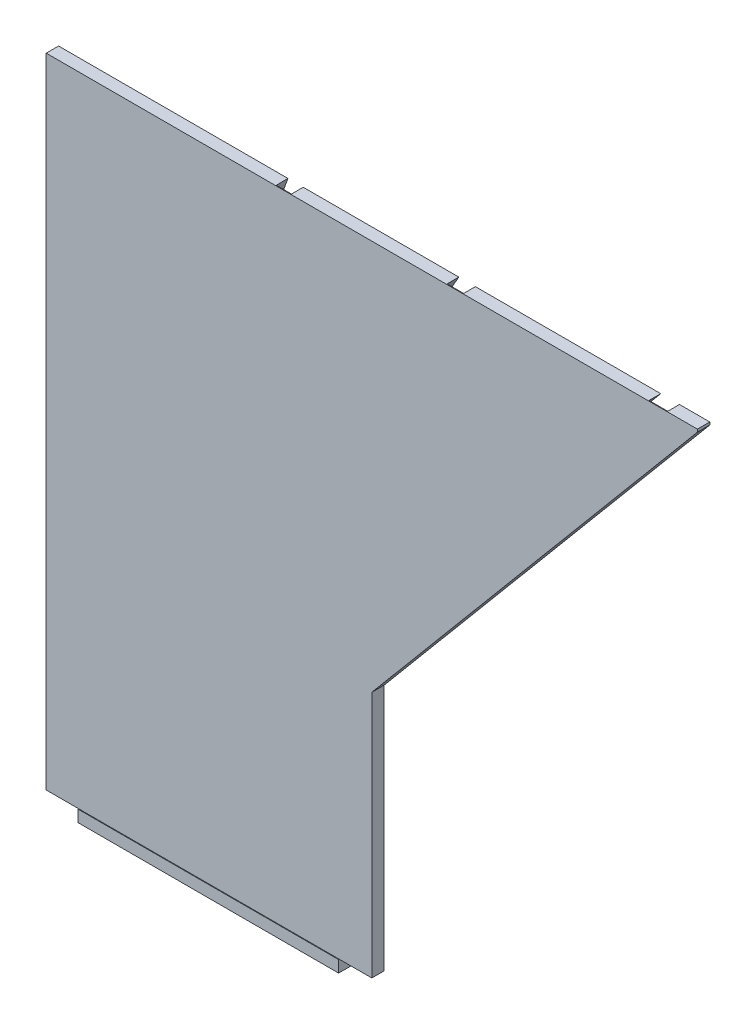
ISO-10303-21;
HEADER;
FILE_DESCRIPTION(('STEP AP214'),'2;1');
FILE_NAME('part.step','',(''),(''),'','','');
FILE_SCHEMA(('AUTOMOTIVE_DESIGN { 1 0 10303 214 1 1 1 1 }'));
ENDSEC;
DATA;
#1=APPLICATION_CONTEXT('core data for automotive mechanical design processes');
#2=APPLICATION_PROTOCOL_DEFINITION('international standard','automotive_design',2000,#1);
#3=PRODUCT_CONTEXT('',#1,'mechanical');
#4=PRODUCT('Part','Part','',(#3));
#5=PRODUCT_RELATED_PRODUCT_CATEGORY('part','',(#4));
#6=PRODUCT_DEFINITION_FORMATION('','',#4);
#7=PRODUCT_DEFINITION_CONTEXT('part definition',#1,'design');
#8=PRODUCT_DEFINITION('design','',#6,#7);
#9=PRODUCT_DEFINITION_SHAPE('','',#8);
#10=(LENGTH_UNIT() NAMED_UNIT(*) SI_UNIT(.MILLI.,.METRE.));
#11=(NAMED_UNIT(*) PLANE_ANGLE_UNIT() SI_UNIT($,.RADIAN.));
#12=(NAMED_UNIT(*) SI_UNIT($,.STERADIAN.) SOLID_ANGLE_UNIT());
#13=UNCERTAINTY_MEASURE_WITH_UNIT(LENGTH_MEASURE(1.E-05),#10,'distance_accuracy_value','');
#14=(GEOMETRIC_REPRESENTATION_CONTEXT(3) GLOBAL_UNCERTAINTY_ASSIGNED_CONTEXT((#13)) GLOBAL_UNIT_ASSIGNED_CONTEXT((#10,
#11,#12)) REPRESENTATION_CONTEXT('',''));
#15=CARTESIAN_POINT('',(0.,0.,0.));
#16=DIRECTION('',(0.,0.,1.));
#17=DIRECTION('',(1.,0.,0.));
#18=AXIS2_PLACEMENT_3D('',#15,#16,#17);
#19=CARTESIAN_POINT('',(1.98987915939745,-1.66970686873775,1.9));
#20=DIRECTION('',(0.76604444311898,-0.642787609686537,0.));
#21=DIRECTION('',(0.642787609686537,0.76604444311898,0.));
#22=AXIS2_PLACEMENT_3D('',#19,#20,#21);
#23=PLANE('',#22);
#24=DIRECTION('',(0.642787609686537,0.766044443118979,0.));
#25=VECTOR('',#24,1.);
#26=CARTESIAN_POINT('',(45.3459111359932,50.,1.8));
#27=LINE('',#26,#25);
#28=CARTESIAN_POINT('',(-19.5261489634952,-27.3115106825532,1.8));
#29=VERTEX_POINT('',#28);
#30=CARTESIAN_POINT('',(45.3459111359932,50.,1.8));
#31=VERTEX_POINT('',#30);
#32=EDGE_CURVE('E59',#29,#31,#27,.T.);
#33=ORIENTED_EDGE('',*,*,#32,.T.);
#34=DIRECTION('',(0.,0.,-1.));
#35=VECTOR('',#34,1.);
#36=CARTESIAN_POINT('',(45.3459111359932,50.,1.9));
#37=LINE('',#36,#35);
#38=CARTESIAN_POINT('',(45.3459111359932,50.,0.));
#39=VERTEX_POINT('',#38);
#40=EDGE_CURVE('E338',#31,#39,#37,.T.);
#41=ORIENTED_EDGE('',*,*,#40,.T.);
#42=DIRECTION('',(-0.642787609686537,-0.76604444311898,0.));
#43=VECTOR('',#42,1.);
#44=CARTESIAN_POINT('',(1.98987915939745,-1.66970686873775,0.));
#45=LINE('',#44,#43);
#46=CARTESIAN_POINT('',(-19.5261489634952,-27.3115106825532,0.));
#47=VERTEX_POINT('',#46);
#48=EDGE_CURVE('E281',#39,#47,#45,.T.);
#49=ORIENTED_EDGE('',*,*,#48,.T.);
#50=DIRECTION('',(0.,0.,-1.));
#51=VECTOR('',#50,1.);
#52=CARTESIAN_POINT('',(-19.5261489634952,-27.3115106825532,1.9));
#53=LINE('',#52,#51);
#54=EDGE_CURVE('E336',#29,#47,#53,.T.);
#55=ORIENTED_EDGE('',*,*,#54,.F.);
#56=EDGE_LOOP('',(#33,#41,#49,#55));
#57=FACE_BOUND('',#56,.T.);
#58=ADVANCED_FACE('F41',(#57),#23,.F.);
#59=CARTESIAN_POINT('',(-21.5160281228926,-25.6418038138154,1.9));
#60=DIRECTION('',(0.642787609686537,0.76604444311898,0.));
#61=DIRECTION('',(-0.76604444311898,0.642787609686537,0.));
#62=AXIS2_PLACEMENT_3D('',#59,#60,#61);
#63=PLANE('',#62);
#64=DIRECTION('',(0.,0.,-1.));
#65=VECTOR('',#64,1.);
#66=CARTESIAN_POINT('',(-21.2114467383573,-25.8973779412424,1.9));
#67=LINE('',#66,#65);
#68=CARTESIAN_POINT('',(-21.2114467383573,-25.8973779412424,1.8));
#69=VERTEX_POINT('',#68);
#70=CARTESIAN_POINT('',(-21.2114467383573,-25.8973779412424,0.));
#71=VERTEX_POINT('',#70);
#72=EDGE_CURVE('E334',#69,#71,#67,.T.);
#73=ORIENTED_EDGE('',*,*,#72,.F.);
#74=DIRECTION('',(0.766044443118977,-0.64278760968654,0.));
#75=VECTOR('',#74,1.);
#76=CARTESIAN_POINT('',(-19.5261489634952,-27.3115106825532,1.8));
#77=LINE('',#76,#75);
#78=EDGE_CURVE('E67',#69,#29,#77,.T.);
#79=ORIENTED_EDGE('',*,*,#78,.T.);
#80=ORIENTED_EDGE('',*,*,#54,.T.);
#81=DIRECTION('',(0.76604444311898,-0.642787609686537,0.));
#82=VECTOR('',#81,1.);
#83=CARTESIAN_POINT('',(-21.5160281228926,-25.6418038138154,0.));
#84=LINE('',#83,#82);
#85=EDGE_CURVE('E286',#71,#47,#84,.T.);
#86=ORIENTED_EDGE('',*,*,#85,.F.);
#87=EDGE_LOOP('',(#73,#79,#80,#86));
#88=FACE_BOUND('',#87,.T.);
#89=ADVANCED_FACE('F439',(#88),#63,.T.);
#90=CARTESIAN_POINT('',(0.304581384535392,-0.255574127427114,1.9));
#91=DIRECTION('',(0.766044443118976,-0.642787609686542,0.));
#92=DIRECTION('',(0.642787609686542,0.766044443118976,0.));
#93=AXIS2_PLACEMENT_3D('',#90,#91,#92);
#94=PLANE('',#93);
#95=DIRECTION('',(0.,0.,-1.));
#96=VECTOR('',#95,1.);
#97=CARTESIAN_POINT('',(42.4740150994622,50.,1.9));
#98=LINE('',#97,#96);
#99=CARTESIAN_POINT('',(42.4740150994622,50.,1.8));
#100=VERTEX_POINT('',#99);
#101=CARTESIAN_POINT('',(42.4740150994622,50.,0.));
#102=VERTEX_POINT('',#101);
#103=EDGE_CURVE('E332',#100,#102,#98,.T.);
#104=ORIENTED_EDGE('',*,*,#103,.F.);
#105=DIRECTION('',(-0.642787609686542,-0.766044443118976,0.));
#106=VECTOR('',#105,1.);
#107=CARTESIAN_POINT('',(-21.2114467383573,-25.8973779412424,1.8));
#108=LINE('',#107,#106);
#109=EDGE_CURVE('E431',#100,#69,#108,.T.);
#110=ORIENTED_EDGE('',*,*,#109,.T.);
#111=ORIENTED_EDGE('',*,*,#72,.T.);
#112=DIRECTION('',(-0.642787609686542,-0.766044443118976,0.));
#113=VECTOR('',#112,1.);
#114=CARTESIAN_POINT('',(0.304581384535392,-0.255574127427114,0.));
#115=LINE('',#114,#113);
#116=EDGE_CURVE('E289',#102,#71,#115,.T.);
#117=ORIENTED_EDGE('',*,*,#116,.F.);
#118=EDGE_LOOP('',(#104,#110,#111,#117));
#119=FACE_BOUND('',#118,.T.);
#120=ADVANCED_FACE('F434',(#119),#94,.T.);
#121=CARTESIAN_POINT('',(-11.146736961228,6.43557158515087,1.9));
#122=DIRECTION('',(0.86602540378444,-0.499999999999998,0.));
#123=DIRECTION('',(0.499999999999998,0.86602540378444,0.));
#124=AXIS2_PLACEMENT_3D('',#121,#122,#123);
#125=PLANE('',#124);
#126=DIRECTION('',(0.499999999999998,0.86602540378444,0.));
#127=VECTOR('',#126,1.);
#128=CARTESIAN_POINT('',(14.0051975111772,50.,1.8));
#129=LINE('',#128,#127);
#130=CARTESIAN_POINT('',(-36.3123451368763,-37.1525403784431,1.8));
#131=VERTEX_POINT('',#130);
#132=CARTESIAN_POINT('',(14.0051975111772,50.,1.8));
#133=VERTEX_POINT('',#132);
#134=EDGE_CURVE('E420',#131,#133,#129,.T.);
#135=ORIENTED_EDGE('',*,*,#134,.T.);
#136=DIRECTION('',(0.,0.,-1.));
#137=VECTOR('',#136,1.);
#138=CARTESIAN_POINT('',(14.0051975111772,50.,1.9));
#139=LINE('',#138,#137);
#140=CARTESIAN_POINT('',(14.0051975111772,50.,0.));
#141=VERTEX_POINT('',#140);
#142=EDGE_CURVE('E330',#133,#141,#139,.T.);
#143=ORIENTED_EDGE('',*,*,#142,.T.);
#144=DIRECTION('',(-0.499999999999998,-0.86602540378444,0.));
#145=VECTOR('',#144,1.);
#146=CARTESIAN_POINT('',(-11.146736961228,6.43557158515087,0.));
#147=LINE('',#146,#145);
#148=CARTESIAN_POINT('',(-36.3123451368763,-37.1525403784431,0.));
#149=VERTEX_POINT('',#148);
#150=EDGE_CURVE('E292',#141,#149,#147,.T.);
#151=ORIENTED_EDGE('',*,*,#150,.T.);
#152=DIRECTION('',(0.,0.,-1.));
#153=VECTOR('',#152,1.);
#154=CARTESIAN_POINT('',(-36.3123451368763,-37.1525403784431,1.9));
#155=LINE('',#154,#153);
#156=EDGE_CURVE('E328',#131,#149,#155,.T.);
#157=ORIENTED_EDGE('',*,*,#156,.F.);
#158=EDGE_LOOP('',(#135,#143,#151,#157));
#159=FACE_BOUND('',#158,.T.);
#160=ADVANCED_FACE('F484',(#159),#125,.F.);
#161=CARTESIAN_POINT('',(-25.1656081756484,-43.5881119635939,1.9));
#162=DIRECTION('',(0.499999999999998,0.866025403784439,0.));
#163=DIRECTION('',(-0.86602540378444,0.499999999999998,0.));
#164=AXIS2_PLACEMENT_3D('',#161,#162,#163);
#165=PLANE('',#164);
#166=DIRECTION('',(0.,0.,-1.));
#167=VECTOR('',#166,1.);
#168=CARTESIAN_POINT('',(-38.2176010252015,-36.0525403784434,1.9));
#169=LINE('',#168,#167);
#170=CARTESIAN_POINT('',(-38.2176010252015,-36.0525403784434,1.8));
#171=VERTEX_POINT('',#170);
#172=CARTESIAN_POINT('',(-38.2176010252015,-36.0525403784434,0.));
#173=VERTEX_POINT('',#172);
#174=EDGE_CURVE('E326',#171,#173,#169,.T.);
#175=ORIENTED_EDGE('',*,*,#174,.F.);
#176=DIRECTION('',(0.866025403784437,-0.500000000000002,0.));
#177=VECTOR('',#176,1.);
#178=CARTESIAN_POINT('',(-36.3123451368763,-37.1525403784431,1.8));
#179=LINE('',#178,#177);
#180=EDGE_CURVE('E422',#171,#131,#179,.T.);
#181=ORIENTED_EDGE('',*,*,#180,.T.);
#182=ORIENTED_EDGE('',*,*,#156,.T.);
#183=DIRECTION('',(0.86602540378444,-0.499999999999998,0.));
#184=VECTOR('',#183,1.);
#185=CARTESIAN_POINT('',(-25.1656081756484,-43.5881119635939,0.));
#186=LINE('',#185,#184);
#187=EDGE_CURVE('E295',#173,#149,#186,.T.);
#188=ORIENTED_EDGE('',*,*,#187,.F.);
#189=EDGE_LOOP('',(#175,#181,#182,#188));
#190=FACE_BOUND('',#189,.T.);
#191=ADVANCED_FACE('F479',(#190),#165,.T.);
#192=CARTESIAN_POINT('',(-13.0519928495532,7.53557158515055,1.9));
#193=DIRECTION('',(0.86602540378444,-0.499999999999997,0.));
#194=DIRECTION('',(0.499999999999997,0.86602540378444,0.));
#195=AXIS2_PLACEMENT_3D('',#192,#193,#194);
#196=PLANE('',#195);
#197=DIRECTION('',(0.,0.,-1.));
#198=VECTOR('',#197,1.);
#199=CARTESIAN_POINT('',(11.4648563267435,50.,1.9));
#200=LINE('',#199,#198);
#201=CARTESIAN_POINT('',(11.4648563267435,50.,1.8));
#202=VERTEX_POINT('',#201);
#203=CARTESIAN_POINT('',(11.4648563267435,50.,0.));
#204=VERTEX_POINT('',#203);
#205=EDGE_CURVE('E324',#202,#204,#200,.T.);
#206=ORIENTED_EDGE('',*,*,#205,.F.);
#207=DIRECTION('',(-0.499999999999997,-0.86602540378444,0.));
#208=VECTOR('',#207,1.);
#209=CARTESIAN_POINT('',(-38.2176010252015,-36.0525403784434,1.8));
#210=LINE('',#209,#208);
#211=EDGE_CURVE('E424',#202,#171,#210,.T.);
#212=ORIENTED_EDGE('',*,*,#211,.T.);
#213=ORIENTED_EDGE('',*,*,#174,.T.);
#214=DIRECTION('',(-0.499999999999997,-0.86602540378444,0.));
#215=VECTOR('',#214,1.);
#216=CARTESIAN_POINT('',(-13.0519928495532,7.53557158515055,0.));
#217=LINE('',#216,#215);
#218=EDGE_CURVE('E298',#204,#173,#217,.T.);
#219=ORIENTED_EDGE('',*,*,#218,.F.);
#220=EDGE_LOOP('',(#206,#212,#213,#219));
#221=FACE_BOUND('',#220,.T.);
#222=ADVANCED_FACE('F475',(#221),#196,.T.);
#223=CARTESIAN_POINT('',(-27.0477589529464,9.84457916247911,1.9));
#224=DIRECTION('',(0.939692620785914,-0.342020143325652,0.));
#225=DIRECTION('',(0.342020143325652,0.939692620785915,0.));
#226=AXIS2_PLACEMENT_3D('',#223,#224,#225);
#227=PLANE('',#226);
#228=DIRECTION('',(0.342020143325652,0.939692620785914,0.));
#229=VECTOR('',#228,1.);
#230=CARTESIAN_POINT('',(-12.4323810236568,50.,1.8));
#231=LINE('',#230,#229);
#232=CARTESIAN_POINT('',(-46.771329023081,-44.3454842362497,1.8));
#233=VERTEX_POINT('',#232);
#234=CARTESIAN_POINT('',(-12.4323810236568,50.,1.8));
#235=VERTEX_POINT('',#234);
#236=EDGE_CURVE('E411',#233,#235,#231,.T.);
#237=ORIENTED_EDGE('',*,*,#236,.T.);
#238=DIRECTION('',(0.,0.,-1.));
#239=VECTOR('',#238,1.);
#240=CARTESIAN_POINT('',(-12.4323810236568,50.,1.9));
#241=LINE('',#240,#239);
#242=CARTESIAN_POINT('',(-12.4323810236568,50.,0.));
#243=VERTEX_POINT('',#242);
#244=EDGE_CURVE('E322',#235,#243,#241,.T.);
#245=ORIENTED_EDGE('',*,*,#244,.T.);
#246=DIRECTION('',(-0.342020143325652,-0.939692620785915,0.));
#247=VECTOR('',#246,1.);
#248=CARTESIAN_POINT('',(-27.0477589529464,9.84457916247911,0.));
#249=LINE('',#248,#247);
#250=CARTESIAN_POINT('',(-46.771329023081,-44.3454842362497,0.));
#251=VERTEX_POINT('',#250);
#252=EDGE_CURVE('E302',#243,#251,#249,.T.);
#253=ORIENTED_EDGE('',*,*,#252,.T.);
#254=DIRECTION('',(0.,0.,-1.));
#255=VECTOR('',#254,1.);
#256=CARTESIAN_POINT('',(-46.771329023081,-44.3454842362497,1.9));
#257=LINE('',#256,#255);
#258=EDGE_CURVE('E320',#233,#251,#257,.T.);
#259=ORIENTED_EDGE('',*,*,#258,.F.);
#260=EDGE_LOOP('',(#237,#245,#253,#259));
#261=FACE_BOUND('',#260,.T.);
#262=ADVANCED_FACE('F568',(#261),#227,.F.);
#263=CARTESIAN_POINT('',(-19.7235700701345,-54.1900633987288,1.9));
#264=DIRECTION('',(0.342020143325651,0.939692620785915,0.));
#265=DIRECTION('',(-0.939692620785915,0.342020143325651,0.));
#266=AXIS2_PLACEMENT_3D('',#263,#264,#265);
#267=PLANE('',#266);
#268=DIRECTION('',(0.,0.,-1.));
#269=VECTOR('',#268,1.);
#270=CARTESIAN_POINT('',(-48.8386527888107,-43.5930399209329,1.9));
#271=LINE('',#270,#269);
#272=CARTESIAN_POINT('',(-48.8386527888107,-43.5930399209329,1.8));
#273=VERTEX_POINT('',#272);
#274=CARTESIAN_POINT('',(-48.8386527888107,-43.5930399209329,0.));
#275=VERTEX_POINT('',#274);
#276=EDGE_CURVE('E318',#273,#275,#271,.T.);
#277=ORIENTED_EDGE('',*,*,#276,.F.);
#278=DIRECTION('',(0.939692620785913,-0.342020143325656,0.));
#279=VECTOR('',#278,1.);
#280=CARTESIAN_POINT('',(-46.771329023081,-44.3454842362497,1.8));
#281=LINE('',#280,#279);
#282=EDGE_CURVE('E413',#273,#233,#281,.T.);
#283=ORIENTED_EDGE('',*,*,#282,.T.);
#284=ORIENTED_EDGE('',*,*,#258,.T.);
#285=DIRECTION('',(0.939692620785915,-0.342020143325651,0.));
#286=VECTOR('',#285,1.);
#287=CARTESIAN_POINT('',(-19.7235700701345,-54.1900633987288,0.));
#288=LINE('',#287,#286);
#289=EDGE_CURVE('E305',#275,#251,#288,.T.);
#290=ORIENTED_EDGE('',*,*,#289,.F.);
#291=EDGE_LOOP('',(#277,#283,#284,#290));
#292=FACE_BOUND('',#291,.T.);
#293=ADVANCED_FACE('F468',(#292),#267,.T.);
#294=CARTESIAN_POINT('',(-29.1150827186754,10.5970234777959,1.9));
#295=DIRECTION('',(0.939692620785911,-0.342020143325662,0.));
#296=DIRECTION('',(0.342020143325662,0.939692620785911,0.));
#297=AXIS2_PLACEMENT_3D('',#294,#295,#296);
#298=PLANE('',#297);
#299=DIRECTION('',(0.,0.,-1.));
#300=VECTOR('',#299,1.);
#301=CARTESIAN_POINT('',(-14.7735721231035,50.,1.9));
#302=LINE('',#301,#300);
#303=CARTESIAN_POINT('',(-14.7735721231035,50.,1.8));
#304=VERTEX_POINT('',#303);
#305=CARTESIAN_POINT('',(-14.7735721231035,50.,0.));
#306=VERTEX_POINT('',#305);
#307=EDGE_CURVE('E316',#304,#306,#302,.T.);
#308=ORIENTED_EDGE('',*,*,#307,.F.);
#309=DIRECTION('',(-0.342020143325662,-0.939692620785911,0.));
#310=VECTOR('',#309,1.);
#311=CARTESIAN_POINT('',(-48.8386527888107,-43.5930399209329,1.8));
#312=LINE('',#311,#310);
#313=EDGE_CURVE('E415',#304,#273,#312,.T.);
#314=ORIENTED_EDGE('',*,*,#313,.T.);
#315=ORIENTED_EDGE('',*,*,#276,.T.);
#316=DIRECTION('',(-0.342020143325662,-0.939692620785911,0.));
#317=VECTOR('',#316,1.);
#318=CARTESIAN_POINT('',(-29.1150827186754,10.5970234777959,0.));
#319=LINE('',#318,#317);
#320=EDGE_CURVE('E308',#306,#275,#319,.T.);
#321=ORIENTED_EDGE('',*,*,#320,.F.);
#322=EDGE_LOOP('',(#308,#314,#315,#321));
#323=FACE_BOUND('',#322,.T.);
#324=ADVANCED_FACE('F463',(#323),#298,.T.);
#325=CARTESIAN_POINT('',(0.,-48.,1.9));
#326=DIRECTION('',(0.,1.,0.));
#327=DIRECTION('',(0.,0.,1.));
#328=AXIS2_PLACEMENT_3D('',#325,#326,#327);
#329=PLANE('',#328);
#330=DIRECTION('',(1.,0.,0.));
#331=VECTOR('',#330,1.);
#332=CARTESIAN_POINT('',(0.,-48.,0.));
#333=LINE('',#332,#331);
#334=CARTESIAN_POINT('',(-50.,-48.,0.));
#335=VERTEX_POINT('',#334);
#336=CARTESIAN_POINT('',(-45.,-48.,0.));
#337=VERTEX_POINT('',#336);
#338=EDGE_CURVE('E232',#335,#337,#333,.T.);
#339=ORIENTED_EDGE('',*,*,#338,.T.);
#340=DIRECTION('',(0.,0.,-1.));
#341=VECTOR('',#340,1.);
#342=CARTESIAN_POINT('',(-45.,-48.,1.9));
#343=LINE('',#342,#341);
#344=CARTESIAN_POINT('',(-45.,-48.,1.9));
#345=VERTEX_POINT('',#344);
#346=EDGE_CURVE('E351',#345,#337,#343,.T.);
#347=ORIENTED_EDGE('',*,*,#346,.F.);
#348=DIRECTION('',(1.,0.,0.));
#349=VECTOR('',#348,1.);
#350=CARTESIAN_POINT('',(0.,-48.,1.9));
#351=LINE('',#350,#349);
#352=CARTESIAN_POINT('',(-50.,-48.,1.9));
#353=VERTEX_POINT('',#352);
#354=EDGE_CURVE('E244',#353,#345,#351,.T.);
#355=ORIENTED_EDGE('',*,*,#354,.F.);
#356=DIRECTION('',(0.,0.,-1.));
#357=VECTOR('',#356,1.);
#358=CARTESIAN_POINT('',(-50.,-48.,1.9));
#359=LINE('',#358,#357);
#360=EDGE_CURVE('E261',#353,#335,#359,.T.);
#361=ORIENTED_EDGE('',*,*,#360,.T.);
#362=EDGE_LOOP('',(#339,#347,#355,#361));
#363=FACE_BOUND('',#362,.T.);
#364=ADVANCED_FACE('F518',(#363),#329,.F.);
#365=CARTESIAN_POINT('',(-45.,0.,1.9));
#366=DIRECTION('',(-1.,0.,0.));
#367=DIRECTION('',(0.,0.,1.));
#368=AXIS2_PLACEMENT_3D('',#365,#366,#367);
#369=PLANE('',#368);
#370=DIRECTION('',(0.,1.,0.));
#371=VECTOR('',#370,1.);
#372=CARTESIAN_POINT('',(-45.,0.,0.));
#373=LINE('',#372,#371);
#374=CARTESIAN_POINT('',(-45.,-49.8,0.));
#375=VERTEX_POINT('',#374);
#376=EDGE_CURVE('E264',#375,#337,#373,.T.);
#377=ORIENTED_EDGE('',*,*,#376,.F.);
#378=DIRECTION('',(0.,0.,1.));
#379=VECTOR('',#378,1.);
#380=CARTESIAN_POINT('',(-45.,-49.8,2.));
#381=LINE('',#380,#379);
#382=CARTESIAN_POINT('',(-45.,-49.8,2.));
#383=VERTEX_POINT('',#382);
#384=EDGE_CURVE('E363',#375,#383,#381,.T.);
#385=ORIENTED_EDGE('',*,*,#384,.T.);
#386=DIRECTION('',(0.,-1.,0.));
#387=VECTOR('',#386,1.);
#388=CARTESIAN_POINT('',(-45.,-50.,2.));
#389=LINE('',#388,#387);
#390=CARTESIAN_POINT('',(-45.,-48.,2.));
#391=VERTEX_POINT('',#390);
#392=EDGE_CURVE('E221',#391,#383,#389,.T.);
#393=ORIENTED_EDGE('',*,*,#392,.F.);
#394=DIRECTION('',(0.,0.,-1.));
#395=VECTOR('',#394,1.);
#396=CARTESIAN_POINT('',(-45.,-48.,2.));
#397=LINE('',#396,#395);
#398=EDGE_CURVE('E233',#391,#345,#397,.T.);
#399=ORIENTED_EDGE('',*,*,#398,.T.);
#400=ORIENTED_EDGE('',*,*,#346,.T.);
#401=EDGE_LOOP('',(#377,#385,#393,#399,#400));
#402=FACE_BOUND('',#401,.T.);
#403=ADVANCED_FACE('F406',(#402),#369,.T.);
#404=CARTESIAN_POINT('',(0.,-50.,1.9));
#405=DIRECTION('',(0.,1.,0.));
#406=DIRECTION('',(-1.,0.,0.));
#407=AXIS2_PLACEMENT_3D('',#404,#405,#406);
#408=PLANE('',#407);
#409=DIRECTION('',(-1.,0.,0.));
#410=VECTOR('',#409,1.);
#411=CARTESIAN_POINT('',(0.,-50.,1.80000000000001));
#412=LINE('',#411,#410);
#413=CARTESIAN_POINT('',(-5.19999999999999,-50.,1.80000000000001));
#414=VERTEX_POINT('',#413);
#415=CARTESIAN_POINT('',(-44.8,-50.,1.80000000000001));
#416=VERTEX_POINT('',#415);
#417=EDGE_CURVE('E358',#414,#416,#412,.T.);
#418=ORIENTED_EDGE('',*,*,#417,.T.);
#419=DIRECTION('',(0.,0.,-1.));
#420=VECTOR('',#419,1.);
#421=CARTESIAN_POINT('',(-44.8,-50.,0.));
#422=LINE('',#421,#420);
#423=CARTESIAN_POINT('',(-44.8,-50.,0.199999999999992));
#424=VERTEX_POINT('',#423);
#425=EDGE_CURVE('E360',#416,#424,#422,.T.);
#426=ORIENTED_EDGE('',*,*,#425,.T.);
#427=DIRECTION('',(1.,0.,0.));
#428=VECTOR('',#427,1.);
#429=CARTESIAN_POINT('',(0.,-50.,0.199999999999992));
#430=LINE('',#429,#428);
#431=CARTESIAN_POINT('',(-5.19999999999999,-50.,0.199999999999992));
#432=VERTEX_POINT('',#431);
#433=EDGE_CURVE('E354',#424,#432,#430,.T.);
#434=ORIENTED_EDGE('',*,*,#433,.T.);
#435=DIRECTION('',(0.,0.,1.));
#436=VECTOR('',#435,1.);
#437=CARTESIAN_POINT('',(-5.19999999999999,-50.,2.));
#438=LINE('',#437,#436);
#439=EDGE_CURVE('E356',#432,#414,#438,.T.);
#440=ORIENTED_EDGE('',*,*,#439,.T.);
#441=EDGE_LOOP('',(#418,#426,#434,#440));
#442=FACE_BOUND('',#441,.T.);
#443=ADVANCED_FACE('F521',(#442),#408,.F.);
#444=CARTESIAN_POINT('',(-5.,0.,1.9));
#445=DIRECTION('',(1.,0.,0.));
#446=DIRECTION('',(0.,0.,-1.));
#447=AXIS2_PLACEMENT_3D('',#444,#445,#446);
#448=PLANE('',#447);
#449=DIRECTION('',(0.,1.,0.));
#450=VECTOR('',#449,1.);
#451=CARTESIAN_POINT('',(-5.,-48.,2.));
#452=LINE('',#451,#450);
#453=CARTESIAN_POINT('',(-5.,-49.8,2.));
#454=VERTEX_POINT('',#453);
#455=CARTESIAN_POINT('',(-5.,-48.,2.));
#456=VERTEX_POINT('',#455);
#457=EDGE_CURVE('E210',#454,#456,#452,.T.);
#458=ORIENTED_EDGE('',*,*,#457,.F.);
#459=DIRECTION('',(0.,0.,-1.));
#460=VECTOR('',#459,1.);
#461=CARTESIAN_POINT('',(-5.,-49.8,0.));
#462=LINE('',#461,#460);
#463=CARTESIAN_POINT('',(-5.,-49.8,0.));
#464=VERTEX_POINT('',#463);
#465=EDGE_CURVE('E51',#454,#464,#462,.T.);
#466=ORIENTED_EDGE('',*,*,#465,.T.);
#467=DIRECTION('',(0.,-1.,0.));
#468=VECTOR('',#467,1.);
#469=CARTESIAN_POINT('',(-5.,0.,0.));
#470=LINE('',#469,#468);
#471=CARTESIAN_POINT('',(-5.,-48.,0.));
#472=VERTEX_POINT('',#471);
#473=EDGE_CURVE('E267',#472,#464,#470,.T.);
#474=ORIENTED_EDGE('',*,*,#473,.F.);
#475=DIRECTION('',(0.,0.,-1.));
#476=VECTOR('',#475,1.);
#477=CARTESIAN_POINT('',(-5.,-48.,1.9));
#478=LINE('',#477,#476);
#479=CARTESIAN_POINT('',(-5.,-48.,1.9));
#480=VERTEX_POINT('',#479);
#481=EDGE_CURVE('E228',#480,#472,#478,.T.);
#482=ORIENTED_EDGE('',*,*,#481,.F.);
#483=DIRECTION('',(0.,0.,-1.));
#484=VECTOR('',#483,1.);
#485=CARTESIAN_POINT('',(-5.,-48.,2.));
#486=LINE('',#485,#484);
#487=EDGE_CURVE('E225',#456,#480,#486,.T.);
#488=ORIENTED_EDGE('',*,*,#487,.F.);
#489=EDGE_LOOP('',(#458,#466,#474,#482,#488));
#490=FACE_BOUND('',#489,.T.);
#491=ADVANCED_FACE('F226',(#490),#448,.T.);
#492=CARTESIAN_POINT('',(0.,-48.,0.));
#493=VERTEX_POINT('',#492);
#494=EDGE_CURVE('E265',#472,#493,#333,.T.);
#495=ORIENTED_EDGE('',*,*,#494,.T.);
#496=DIRECTION('',(0.,0.,-1.));
#497=VECTOR('',#496,1.);
#498=CARTESIAN_POINT('',(0.,-48.,1.9));
#499=LINE('',#498,#497);
#500=CARTESIAN_POINT('',(0.,-48.,1.9));
#501=VERTEX_POINT('',#500);
#502=EDGE_CURVE('E347',#501,#493,#499,.T.);
#503=ORIENTED_EDGE('',*,*,#502,.F.);
#504=EDGE_CURVE('E247',#480,#501,#351,.T.);
#505=ORIENTED_EDGE('',*,*,#504,.F.);
#506=ORIENTED_EDGE('',*,*,#481,.T.);
#507=EDGE_LOOP('',(#495,#503,#505,#506));
#508=FACE_BOUND('',#507,.T.);
#509=ADVANCED_FACE('F394',(#508),#329,.F.);
#510=CARTESIAN_POINT('',(0.,0.,1.9));
#511=DIRECTION('',(-1.,0.,0.));
#512=DIRECTION('',(0.,0.,1.));
#513=AXIS2_PLACEMENT_3D('',#510,#511,#512);
#514=PLANE('',#513);
#515=DIRECTION('',(0.,1.,0.));
#516=VECTOR('',#515,1.);
#517=CARTESIAN_POINT('',(0.,0.,0.));
#518=LINE('',#517,#516);
#519=CARTESIAN_POINT('',(0.,-10.,0.));
#520=VERTEX_POINT('',#519);
#521=EDGE_CURVE('E270',#493,#520,#518,.T.);
#522=ORIENTED_EDGE('',*,*,#521,.T.);
#523=DIRECTION('',(0.,0.,-1.));
#524=VECTOR('',#523,1.);
#525=CARTESIAN_POINT('',(0.,-10.,1.9));
#526=LINE('',#525,#524);
#527=CARTESIAN_POINT('',(0.,-10.,1.9));
#528=VERTEX_POINT('',#527);
#529=EDGE_CURVE('E344',#528,#520,#526,.T.);
#530=ORIENTED_EDGE('',*,*,#529,.F.);
#531=DIRECTION('',(0.,1.,0.));
#532=VECTOR('',#531,1.);
#533=CARTESIAN_POINT('',(0.,0.,1.9));
#534=LINE('',#533,#532);
#535=EDGE_CURVE('E249',#501,#528,#534,.T.);
#536=ORIENTED_EDGE('',*,*,#535,.F.);
#537=ORIENTED_EDGE('',*,*,#502,.T.);
#538=EDGE_LOOP('',(#522,#530,#536,#537));
#539=FACE_BOUND('',#538,.T.);
#540=ADVANCED_FACE('F397',(#539),#514,.F.);
#541=CARTESIAN_POINT('',(4.92403876506104,-4.13175911166533,1.9));
#542=DIRECTION('',(-0.766044443118979,0.642787609686538,0.));
#543=DIRECTION('',(-0.642787609686538,-0.766044443118979,0.));
#544=AXIS2_PLACEMENT_3D('',#541,#542,#543);
#545=PLANE('',#544);
#546=DIRECTION('',(0.642787609686538,0.766044443118979,0.));
#547=VECTOR('',#546,1.);
#548=CARTESIAN_POINT('',(4.92403876506104,-4.13175911166533,0.));
#549=LINE('',#548,#547);
#550=CARTESIAN_POINT('',(50.,49.5876796297107,0.));
#551=VERTEX_POINT('',#550);
#552=EDGE_CURVE('E272',#520,#551,#549,.T.);
#553=ORIENTED_EDGE('',*,*,#552,.T.);
#554=DIRECTION('',(0.,0.,-1.));
#555=VECTOR('',#554,1.);
#556=CARTESIAN_POINT('',(50.,49.5876796297107,1.9));
#557=LINE('',#556,#555);
#558=CARTESIAN_POINT('',(50.,49.5876796297107,1.9));
#559=VERTEX_POINT('',#558);
#560=EDGE_CURVE('E342',#559,#551,#557,.T.);
#561=ORIENTED_EDGE('',*,*,#560,.F.);
#562=DIRECTION('',(0.642787609686538,0.766044443118979,0.));
#563=VECTOR('',#562,1.);
#564=CARTESIAN_POINT('',(4.92403876506104,-4.13175911166533,1.9));
#565=LINE('',#564,#563);
#566=EDGE_CURVE('E251',#528,#559,#565,.T.);
#567=ORIENTED_EDGE('',*,*,#566,.F.);
#568=ORIENTED_EDGE('',*,*,#529,.T.);
#569=EDGE_LOOP('',(#553,#561,#567,#568));
#570=FACE_BOUND('',#569,.T.);
#571=ADVANCED_FACE('F509',(#570),#545,.F.);
#572=CARTESIAN_POINT('',(50.,0.,1.9));
#573=DIRECTION('',(1.,0.,0.));
#574=DIRECTION('',(0.,1.,0.));
#575=AXIS2_PLACEMENT_3D('',#572,#573,#574);
#576=PLANE('',#575);
#577=DIRECTION('',(0.,-1.,0.));
#578=VECTOR('',#577,1.);
#579=CARTESIAN_POINT('',(50.,0.,0.));
#580=LINE('',#579,#578);
#581=CARTESIAN_POINT('',(50.,50.,0.));
#582=VERTEX_POINT('',#581);
#583=EDGE_CURVE('E275',#582,#551,#580,.T.);
#584=ORIENTED_EDGE('',*,*,#583,.F.);
#585=DIRECTION('',(0.,0.,-1.));
#586=VECTOR('',#585,1.);
#587=CARTESIAN_POINT('',(50.,50.,1.9));
#588=LINE('',#587,#586);
#589=CARTESIAN_POINT('',(50.,50.,1.9));
#590=VERTEX_POINT('',#589);
#591=EDGE_CURVE('E340',#590,#582,#588,.T.);
#592=ORIENTED_EDGE('',*,*,#591,.F.);
#593=DIRECTION('',(0.,-1.,0.));
#594=VECTOR('',#593,1.);
#595=CARTESIAN_POINT('',(50.,0.,1.9));
#596=LINE('',#595,#594);
#597=EDGE_CURVE('E253',#590,#559,#596,.T.);
#598=ORIENTED_EDGE('',*,*,#597,.T.);
#599=ORIENTED_EDGE('',*,*,#560,.T.);
#600=EDGE_LOOP('',(#584,#592,#598,#599));
#601=FACE_BOUND('',#600,.T.);
#602=ADVANCED_FACE('F506',(#601),#576,.T.);
#603=CARTESIAN_POINT('',(0.,50.,1.9));
#604=DIRECTION('',(0.,1.,0.));
#605=DIRECTION('',(0.,0.,1.));
#606=AXIS2_PLACEMENT_3D('',#603,#604,#605);
#607=PLANE('',#606);
#608=DIRECTION('',(1.,0.,0.));
#609=VECTOR('',#608,1.);
#610=CARTESIAN_POINT('',(0.,50.,0.));
#611=LINE('',#610,#609);
#612=CARTESIAN_POINT('',(-50.,50.,0.));
#613=VERTEX_POINT('',#612);
#614=EDGE_CURVE('E282',#613,#306,#611,.T.);
#615=ORIENTED_EDGE('',*,*,#614,.F.);
#616=DIRECTION('',(0.,0.,-1.));
#617=VECTOR('',#616,1.);
#618=CARTESIAN_POINT('',(-50.,50.,1.9));
#619=LINE('',#618,#617);
#620=CARTESIAN_POINT('',(-50.,50.,1.9));
#621=VERTEX_POINT('',#620);
#622=EDGE_CURVE('E314',#621,#613,#619,.T.);
#623=ORIENTED_EDGE('',*,*,#622,.F.);
#624=DIRECTION('',(1.,0.,0.));
#625=VECTOR('',#624,1.);
#626=CARTESIAN_POINT('',(0.,50.,1.9));
#627=LINE('',#626,#625);
#628=EDGE_CURVE('E256',#621,#590,#627,.T.);
#629=ORIENTED_EDGE('',*,*,#628,.T.);
#630=ORIENTED_EDGE('',*,*,#591,.T.);
#631=EDGE_CURVE('E278',#39,#582,#611,.T.);
#632=ORIENTED_EDGE('',*,*,#631,.F.);
#633=ORIENTED_EDGE('',*,*,#40,.F.);
#634=DIRECTION('',(-1.,0.,0.));
#635=VECTOR('',#634,1.);
#636=CARTESIAN_POINT('',(42.4740150994622,50.,1.8));
#637=LINE('',#636,#635);
#638=EDGE_CURVE('E426',#31,#100,#637,.T.);
#639=ORIENTED_EDGE('',*,*,#638,.T.);
#640=ORIENTED_EDGE('',*,*,#103,.T.);
#641=EDGE_CURVE('E283',#141,#102,#611,.T.);
#642=ORIENTED_EDGE('',*,*,#641,.F.);
#643=ORIENTED_EDGE('',*,*,#142,.F.);
#644=DIRECTION('',(-1.,0.,0.));
#645=VECTOR('',#644,1.);
#646=CARTESIAN_POINT('',(11.4648563267435,50.,1.8));
#647=LINE('',#646,#645);
#648=EDGE_CURVE('E417',#133,#202,#647,.T.);
#649=ORIENTED_EDGE('',*,*,#648,.T.);
#650=ORIENTED_EDGE('',*,*,#205,.T.);
#651=EDGE_CURVE('E301',#243,#204,#611,.T.);
#652=ORIENTED_EDGE('',*,*,#651,.F.);
#653=ORIENTED_EDGE('',*,*,#244,.F.);
#654=DIRECTION('',(-1.,0.,0.));
#655=VECTOR('',#654,1.);
#656=CARTESIAN_POINT('',(-14.7735721231035,50.,1.8));
#657=LINE('',#656,#655);
#658=EDGE_CURVE('E371',#235,#304,#657,.T.);
#659=ORIENTED_EDGE('',*,*,#658,.T.);
#660=ORIENTED_EDGE('',*,*,#307,.T.);
#661=EDGE_LOOP('',(#615,#623,#629,#630,#632,#633,#639,#640,#642,#643,#649,#650,#652,#653,#659,#660));
#662=FACE_BOUND('',#661,.T.);
#663=ADVANCED_FACE('F443',(#662),#607,.T.);
#664=CARTESIAN_POINT('',(-50.,0.,1.9));
#665=DIRECTION('',(1.,0.,0.));
#666=DIRECTION('',(0.,1.,0.));
#667=AXIS2_PLACEMENT_3D('',#664,#665,#666);
#668=PLANE('',#667);
#669=DIRECTION('',(0.,-1.,0.));
#670=VECTOR('',#669,1.);
#671=CARTESIAN_POINT('',(-50.,0.,0.));
#672=LINE('',#671,#670);
#673=EDGE_CURVE('E248',#613,#335,#672,.T.);
#674=ORIENTED_EDGE('',*,*,#673,.T.);
#675=ORIENTED_EDGE('',*,*,#360,.F.);
#676=DIRECTION('',(0.,-1.,0.));
#677=VECTOR('',#676,1.);
#678=CARTESIAN_POINT('',(-50.,0.,1.9));
#679=LINE('',#678,#677);
#680=EDGE_CURVE('E259',#621,#353,#679,.T.);
#681=ORIENTED_EDGE('',*,*,#680,.F.);
#682=ORIENTED_EDGE('',*,*,#622,.T.);
#683=EDGE_LOOP('',(#674,#675,#681,#682));
#684=FACE_BOUND('',#683,.T.);
#685=ADVANCED_FACE('F556',(#684),#668,.F.);
#686=CARTESIAN_POINT('',(0.,0.,1.9));
#687=DIRECTION('',(0.,0.,1.));
#688=DIRECTION('',(1.,0.,0.));
#689=AXIS2_PLACEMENT_3D('',#686,#687,#688);
#690=PLANE('',#689);
#691=DIRECTION('',(-1.,0.,0.));
#692=VECTOR('',#691,1.);
#693=CARTESIAN_POINT('',(-45.,-48.,1.9));
#694=LINE('',#693,#692);
#695=EDGE_CURVE('E242',#480,#345,#694,.T.);
#696=ORIENTED_EDGE('',*,*,#695,.F.);
#697=ORIENTED_EDGE('',*,*,#504,.T.);
#698=ORIENTED_EDGE('',*,*,#535,.T.);
#699=ORIENTED_EDGE('',*,*,#566,.T.);
#700=ORIENTED_EDGE('',*,*,#597,.F.);
#701=ORIENTED_EDGE('',*,*,#628,.F.);
#702=ORIENTED_EDGE('',*,*,#680,.T.);
#703=ORIENTED_EDGE('',*,*,#354,.T.);
#704=EDGE_LOOP('',(#696,#697,#698,#699,#700,#701,#702,#703));
#705=FACE_BOUND('',#704,.T.);
#706=ADVANCED_FACE('F401',(#705),#690,.T.);
#707=CARTESIAN_POINT('',(0.,0.,0.));
#708=DIRECTION('',(0.,0.,1.));
#709=DIRECTION('',(1.,0.,0.));
#710=AXIS2_PLACEMENT_3D('',#707,#708,#709);
#711=PLANE('',#710);
#712=ORIENTED_EDGE('',*,*,#473,.T.);
#713=DIRECTION('',(-1.,0.,0.));
#714=VECTOR('',#713,1.);
#715=CARTESIAN_POINT('',(0.,-49.8,0.));
#716=LINE('',#715,#714);
#717=EDGE_CURVE('E11',#464,#375,#716,.T.);
#718=ORIENTED_EDGE('',*,*,#717,.T.);
#719=ORIENTED_EDGE('',*,*,#376,.T.);
#720=ORIENTED_EDGE('',*,*,#338,.F.);
#721=ORIENTED_EDGE('',*,*,#673,.F.);
#722=ORIENTED_EDGE('',*,*,#614,.T.);
#723=ORIENTED_EDGE('',*,*,#320,.T.);
#724=ORIENTED_EDGE('',*,*,#289,.T.);
#725=ORIENTED_EDGE('',*,*,#252,.F.);
#726=ORIENTED_EDGE('',*,*,#651,.T.);
#727=ORIENTED_EDGE('',*,*,#218,.T.);
#728=ORIENTED_EDGE('',*,*,#187,.T.);
#729=ORIENTED_EDGE('',*,*,#150,.F.);
#730=ORIENTED_EDGE('',*,*,#641,.T.);
#731=ORIENTED_EDGE('',*,*,#116,.T.);
#732=ORIENTED_EDGE('',*,*,#85,.T.);
#733=ORIENTED_EDGE('',*,*,#48,.F.);
#734=ORIENTED_EDGE('',*,*,#631,.T.);
#735=ORIENTED_EDGE('',*,*,#583,.T.);
#736=ORIENTED_EDGE('',*,*,#552,.F.);
#737=ORIENTED_EDGE('',*,*,#521,.F.);
#738=ORIENTED_EDGE('',*,*,#494,.F.);
#739=EDGE_LOOP('',(#712,#718,#719,#720,#721,#722,#723,#724,#725,#726,#727,#728,#729,#730,#731,
#732,#733,#734,#735,#736,#737,#738));
#740=FACE_BOUND('',#739,.T.);
#741=ADVANCED_FACE('F388',(#740),#711,.F.);
#742=CARTESIAN_POINT('',(-45.,-48.,2.));
#743=DIRECTION('',(0.,-1.,0.));
#744=DIRECTION('',(0.,0.,-1.));
#745=AXIS2_PLACEMENT_3D('',#742,#743,#744);
#746=PLANE('',#745);
#747=ORIENTED_EDGE('',*,*,#695,.T.);
#748=ORIENTED_EDGE('',*,*,#398,.F.);
#749=DIRECTION('',(-1.,0.,0.));
#750=VECTOR('',#749,1.);
#751=CARTESIAN_POINT('',(-45.,-48.,2.));
#752=LINE('',#751,#750);
#753=EDGE_CURVE('E215',#456,#391,#752,.T.);
#754=ORIENTED_EDGE('',*,*,#753,.F.);
#755=ORIENTED_EDGE('',*,*,#487,.T.);
#756=EDGE_LOOP('',(#747,#748,#754,#755));
#757=FACE_BOUND('',#756,.T.);
#758=ADVANCED_FACE('F235',(#757),#746,.F.);
#759=CARTESIAN_POINT('',(0.,0.,2.));
#760=DIRECTION('',(0.,0.,-1.));
#761=DIRECTION('',(-1.,0.,0.));
#762=AXIS2_PLACEMENT_3D('',#759,#760,#761);
#763=PLANE('',#762);
#764=ORIENTED_EDGE('',*,*,#392,.T.);
#765=DIRECTION('',(1.,0.,0.));
#766=VECTOR('',#765,1.);
#767=CARTESIAN_POINT('',(0.,-49.8,2.));
#768=LINE('',#767,#766);
#769=EDGE_CURVE('E218',#383,#454,#768,.T.);
#770=ORIENTED_EDGE('',*,*,#769,.T.);
#771=ORIENTED_EDGE('',*,*,#457,.T.);
#772=ORIENTED_EDGE('',*,*,#753,.T.);
#773=EDGE_LOOP('',(#764,#770,#771,#772));
#774=FACE_BOUND('',#773,.T.);
#775=ADVANCED_FACE('F213',(#774),#763,.F.);
#776=CARTESIAN_POINT('',(-5.,-49.8,1.9));
#777=DIRECTION('',(0.707106781186549,-0.707106781186546,0.));
#778=DIRECTION('',(0.,0.,1.));
#779=AXIS2_PLACEMENT_3D('',#776,#777,#778);
#780=PLANE('',#779);
#781=DIRECTION('',(0.577350269189617,0.57735026918962,-0.57735026918964));
#782=VECTOR('',#781,1.);
#783=CARTESIAN_POINT('',(-3.46666666666671,-48.2666666666667,-1.53333333333336));
#784=LINE('',#783,#782);
#785=EDGE_CURVE('E372',#464,#432,#784,.F.);
#786=ORIENTED_EDGE('',*,*,#785,.F.);
#787=ORIENTED_EDGE('',*,*,#465,.F.);
#788=DIRECTION('',(0.577350269189617,0.57735026918962,0.57735026918964));
#789=VECTOR('',#788,1.);
#790=CARTESIAN_POINT('',(-5.03333333333334,-49.8333333333334,1.96666666666667));
#791=LINE('',#790,#789);
#792=EDGE_CURVE('E46',#414,#454,#791,.T.);
#793=ORIENTED_EDGE('',*,*,#792,.F.);
#794=ORIENTED_EDGE('',*,*,#439,.F.);
#795=EDGE_LOOP('',(#786,#787,#793,#794));
#796=FACE_BOUND('',#795,.T.);
#797=ADVANCED_FACE('F44',(#796),#780,.T.);
#798=CARTESIAN_POINT('',(0.,-49.8,2.));
#799=DIRECTION('',(0.,0.70710678118656,-0.707106781186535));
#800=DIRECTION('',(1.,0.,0.));
#801=AXIS2_PLACEMENT_3D('',#798,#799,#800);
#802=PLANE('',#801);
#803=ORIENTED_EDGE('',*,*,#792,.T.);
#804=ORIENTED_EDGE('',*,*,#769,.F.);
#805=DIRECTION('',(-0.577350269189633,0.577350269189612,0.577350269189633));
#806=VECTOR('',#805,1.);
#807=CARTESIAN_POINT('',(-29.9999999999997,-64.7999999999999,-13.0000000000003));
#808=LINE('',#807,#806);
#809=EDGE_CURVE('E370',#416,#383,#808,.T.);
#810=ORIENTED_EDGE('',*,*,#809,.F.);
#811=ORIENTED_EDGE('',*,*,#417,.F.);
#812=EDGE_LOOP('',(#803,#804,#810,#811));
#813=FACE_BOUND('',#812,.T.);
#814=ADVANCED_FACE('F382',(#813),#802,.F.);
#815=CARTESIAN_POINT('',(0.,-50.,0.199999999999992));
#816=DIRECTION('',(0.,0.70710678118656,0.707106781186535));
#817=DIRECTION('',(1.,0.,0.));
#818=AXIS2_PLACEMENT_3D('',#815,#816,#817);
#819=PLANE('',#818);
#820=ORIENTED_EDGE('',*,*,#785,.T.);
#821=ORIENTED_EDGE('',*,*,#433,.F.);
#822=DIRECTION('',(0.577350269189633,-0.577350269189612,0.577350269189633));
#823=VECTOR('',#822,1.);
#824=CARTESIAN_POINT('',(-29.8666666666663,-64.9333333333332,15.1333333333337));
#825=LINE('',#824,#823);
#826=EDGE_CURVE('E368',#375,#424,#825,.T.);
#827=ORIENTED_EDGE('',*,*,#826,.F.);
#828=ORIENTED_EDGE('',*,*,#717,.F.);
#829=EDGE_LOOP('',(#820,#821,#827,#828));
#830=FACE_BOUND('',#829,.T.);
#831=ADVANCED_FACE('F533',(#830),#819,.F.);
#832=CARTESIAN_POINT('',(-44.8,-50.,1.9));
#833=DIRECTION('',(-0.707106781186535,-0.70710678118656,0.));
#834=DIRECTION('',(0.,0.,1.));
#835=AXIS2_PLACEMENT_3D('',#832,#833,#834);
#836=PLANE('',#835);
#837=ORIENTED_EDGE('',*,*,#809,.T.);
#838=ORIENTED_EDGE('',*,*,#384,.F.);
#839=ORIENTED_EDGE('',*,*,#826,.T.);
#840=ORIENTED_EDGE('',*,*,#425,.F.);
#841=EDGE_LOOP('',(#837,#838,#839,#840));
#842=FACE_BOUND('',#841,.T.);
#843=ADVANCED_FACE('F495',(#842),#836,.T.);
#844=CARTESIAN_POINT('',(0.,0.,1.8));
#845=DIRECTION('',(0.,0.,1.));
#846=DIRECTION('',(1.,0.,0.));
#847=AXIS2_PLACEMENT_3D('',#844,#845,#846);
#848=PLANE('',#847);
#849=ORIENTED_EDGE('',*,*,#313,.F.);
#850=ORIENTED_EDGE('',*,*,#658,.F.);
#851=ORIENTED_EDGE('',*,*,#236,.F.);
#852=ORIENTED_EDGE('',*,*,#282,.F.);
#853=EDGE_LOOP('',(#849,#850,#851,#852));
#854=FACE_BOUND('',#853,.T.);
#855=ADVANCED_FACE('F488',(#854),#848,.F.);
#856=CARTESIAN_POINT('',(0.,0.,1.8));
#857=DIRECTION('',(0.,0.,1.));
#858=DIRECTION('',(1.,0.,0.));
#859=AXIS2_PLACEMENT_3D('',#856,#857,#858);
#860=PLANE('',#859);
#861=ORIENTED_EDGE('',*,*,#211,.F.);
#862=ORIENTED_EDGE('',*,*,#648,.F.);
#863=ORIENTED_EDGE('',*,*,#134,.F.);
#864=ORIENTED_EDGE('',*,*,#180,.F.);
#865=EDGE_LOOP('',(#861,#862,#863,#864));
#866=FACE_BOUND('',#865,.T.);
#867=ADVANCED_FACE('F486',(#866),#860,.F.);
#868=CARTESIAN_POINT('',(0.,0.,1.8));
#869=DIRECTION('',(0.,0.,1.));
#870=DIRECTION('',(1.,0.,0.));
#871=AXIS2_PLACEMENT_3D('',#868,#869,#870);
#872=PLANE('',#871);
#873=ORIENTED_EDGE('',*,*,#109,.F.);
#874=ORIENTED_EDGE('',*,*,#638,.F.);
#875=ORIENTED_EDGE('',*,*,#32,.F.);
#876=ORIENTED_EDGE('',*,*,#78,.F.);
#877=EDGE_LOOP('',(#873,#874,#875,#876));
#878=FACE_BOUND('',#877,.T.);
#879=ADVANCED_FACE('F440',(#878),#872,.F.);
#880=CLOSED_SHELL('',(#58,#89,#120,#160,#191,#222,#262,#293,#324,#364,#403,#443,#491,#509,#540,
#571,#602,#663,#685,#706,#741,#758,#775,#797,#814,#831,#843,#855,#867,#879));
#881=MANIFOLD_SOLID_BREP('B2',#880);
#882=ADVANCED_BREP_SHAPE_REPRESENTATION('',(#18,#881),#14);
#883=SHAPE_DEFINITION_REPRESENTATION(#9,#882);
ENDSEC;
END-ISO-10303-21;
